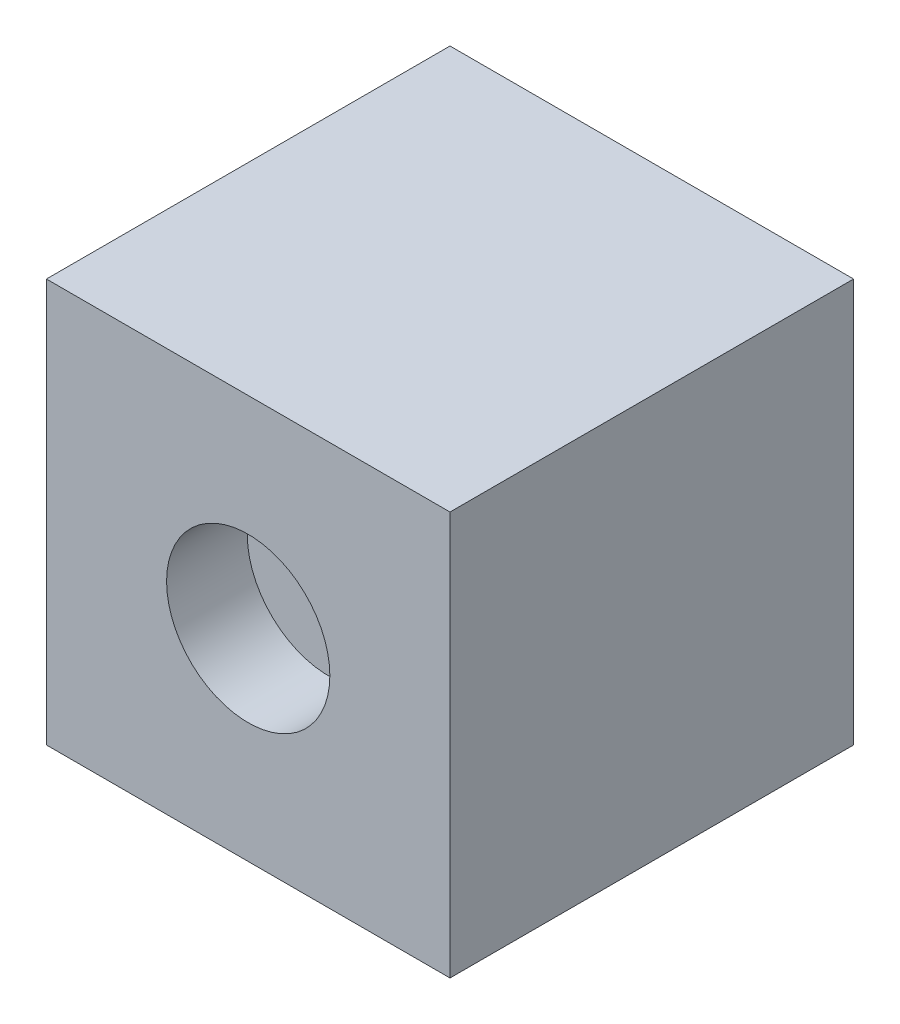
ISO-10303-21;
HEADER;
FILE_DESCRIPTION(('STEP AP214'),'2;1');
FILE_NAME('part.step','',(''),(''),'','','');
FILE_SCHEMA(('AUTOMOTIVE_DESIGN { 1 0 10303 214 1 1 1 1 }'));
ENDSEC;
DATA;
#1=APPLICATION_CONTEXT('core data for automotive mechanical design processes');
#2=APPLICATION_PROTOCOL_DEFINITION('international standard','automotive_design',2000,#1);
#3=PRODUCT_CONTEXT('',#1,'mechanical');
#4=PRODUCT('Part','Part','',(#3));
#5=PRODUCT_RELATED_PRODUCT_CATEGORY('part','',(#4));
#6=PRODUCT_DEFINITION_FORMATION('','',#4);
#7=PRODUCT_DEFINITION_CONTEXT('part definition',#1,'design');
#8=PRODUCT_DEFINITION('design','',#6,#7);
#9=PRODUCT_DEFINITION_SHAPE('','',#8);
#10=(LENGTH_UNIT() NAMED_UNIT(*) SI_UNIT(.MILLI.,.METRE.));
#11=(NAMED_UNIT(*) PLANE_ANGLE_UNIT() SI_UNIT($,.RADIAN.));
#12=(NAMED_UNIT(*) SI_UNIT($,.STERADIAN.) SOLID_ANGLE_UNIT());
#13=UNCERTAINTY_MEASURE_WITH_UNIT(LENGTH_MEASURE(1.E-05),#10,'distance_accuracy_value','');
#14=(GEOMETRIC_REPRESENTATION_CONTEXT(3) GLOBAL_UNCERTAINTY_ASSIGNED_CONTEXT((#13)) GLOBAL_UNIT_ASSIGNED_CONTEXT((#10,
#11,#12)) REPRESENTATION_CONTEXT('',''));
#15=CARTESIAN_POINT('',(0.,0.,0.));
#16=DIRECTION('',(0.,0.,1.));
#17=DIRECTION('',(1.,0.,0.));
#18=AXIS2_PLACEMENT_3D('',#15,#16,#17);
#19=CARTESIAN_POINT('',(25.,25.,50.));
#20=DIRECTION('',(-1.,0.,0.));
#21=DIRECTION('',(0.,-1.,0.));
#22=AXIS2_PLACEMENT_3D('',#19,#20,#21);
#23=PLANE('',#22);
#24=DIRECTION('',(0.,1.,0.));
#25=VECTOR('',#24,1.);
#26=CARTESIAN_POINT('',(25.,25.,0.));
#27=LINE('',#26,#25);
#28=CARTESIAN_POINT('',(25.,-25.,0.));
#29=VERTEX_POINT('',#28);
#30=CARTESIAN_POINT('',(25.,25.,0.));
#31=VERTEX_POINT('',#30);
#32=EDGE_CURVE('E113',#29,#31,#27,.T.);
#33=ORIENTED_EDGE('',*,*,#32,.T.);
#34=DIRECTION('',(0.,0.,-1.));
#35=VECTOR('',#34,1.);
#36=CARTESIAN_POINT('',(25.,25.,50.));
#37=LINE('',#36,#35);
#38=CARTESIAN_POINT('',(25.,25.,50.));
#39=VERTEX_POINT('',#38);
#40=EDGE_CURVE('E11',#39,#31,#37,.T.);
#41=ORIENTED_EDGE('',*,*,#40,.F.);
#42=DIRECTION('',(0.,1.,0.));
#43=VECTOR('',#42,1.);
#44=CARTESIAN_POINT('',(25.,25.,50.));
#45=LINE('',#44,#43);
#46=CARTESIAN_POINT('',(25.,-25.,50.));
#47=VERTEX_POINT('',#46);
#48=EDGE_CURVE('E97',#47,#39,#45,.T.);
#49=ORIENTED_EDGE('',*,*,#48,.F.);
#50=DIRECTION('',(0.,0.,-1.));
#51=VECTOR('',#50,1.);
#52=CARTESIAN_POINT('',(25.,-25.,50.));
#53=LINE('',#52,#51);
#54=EDGE_CURVE('E109',#47,#29,#53,.T.);
#55=ORIENTED_EDGE('',*,*,#54,.T.);
#56=EDGE_LOOP('',(#33,#41,#49,#55));
#57=FACE_BOUND('',#56,.T.);
#58=ADVANCED_FACE('F45',(#57),#23,.F.);
#59=CARTESIAN_POINT('',(-25.,25.,50.));
#60=DIRECTION('',(0.,-1.,0.));
#61=DIRECTION('',(0.,0.,-1.));
#62=AXIS2_PLACEMENT_3D('',#59,#60,#61);
#63=PLANE('',#62);
#64=DIRECTION('',(-1.,0.,0.));
#65=VECTOR('',#64,1.);
#66=CARTESIAN_POINT('',(-25.,25.,0.));
#67=LINE('',#66,#65);
#68=CARTESIAN_POINT('',(-25.,25.,0.));
#69=VERTEX_POINT('',#68);
#70=EDGE_CURVE('E102',#31,#69,#67,.T.);
#71=ORIENTED_EDGE('',*,*,#70,.T.);
#72=DIRECTION('',(0.,0.,-1.));
#73=VECTOR('',#72,1.);
#74=CARTESIAN_POINT('',(-25.,25.,50.));
#75=LINE('',#74,#73);
#76=CARTESIAN_POINT('',(-25.,25.,50.));
#77=VERTEX_POINT('',#76);
#78=EDGE_CURVE('E54',#77,#69,#75,.T.);
#79=ORIENTED_EDGE('',*,*,#78,.F.);
#80=DIRECTION('',(-1.,0.,0.));
#81=VECTOR('',#80,1.);
#82=CARTESIAN_POINT('',(-25.,25.,50.));
#83=LINE('',#82,#81);
#84=EDGE_CURVE('E92',#39,#77,#83,.T.);
#85=ORIENTED_EDGE('',*,*,#84,.F.);
#86=ORIENTED_EDGE('',*,*,#40,.T.);
#87=EDGE_LOOP('',(#71,#79,#85,#86));
#88=FACE_BOUND('',#87,.T.);
#89=ADVANCED_FACE('F101',(#88),#63,.F.);
#90=CARTESIAN_POINT('',(-25.,25.,50.));
#91=DIRECTION('',(1.,0.,0.));
#92=DIRECTION('',(0.,1.,0.));
#93=AXIS2_PLACEMENT_3D('',#90,#91,#92);
#94=PLANE('',#93);
#95=DIRECTION('',(0.,-1.,0.));
#96=VECTOR('',#95,1.);
#97=CARTESIAN_POINT('',(-25.,25.,0.));
#98=LINE('',#97,#96);
#99=CARTESIAN_POINT('',(-25.,-25.,0.));
#100=VERTEX_POINT('',#99);
#101=EDGE_CURVE('E79',#69,#100,#98,.T.);
#102=ORIENTED_EDGE('',*,*,#101,.T.);
#103=DIRECTION('',(0.,0.,-1.));
#104=VECTOR('',#103,1.);
#105=CARTESIAN_POINT('',(-25.,-25.,50.));
#106=LINE('',#105,#104);
#107=CARTESIAN_POINT('',(-25.,-25.,50.));
#108=VERTEX_POINT('',#107);
#109=EDGE_CURVE('E104',#108,#100,#106,.T.);
#110=ORIENTED_EDGE('',*,*,#109,.F.);
#111=DIRECTION('',(0.,-1.,0.));
#112=VECTOR('',#111,1.);
#113=CARTESIAN_POINT('',(-25.,25.,50.));
#114=LINE('',#113,#112);
#115=EDGE_CURVE('E95',#77,#108,#114,.T.);
#116=ORIENTED_EDGE('',*,*,#115,.F.);
#117=ORIENTED_EDGE('',*,*,#78,.T.);
#118=EDGE_LOOP('',(#102,#110,#116,#117));
#119=FACE_BOUND('',#118,.T.);
#120=ADVANCED_FACE('F105',(#119),#94,.F.);
#121=CARTESIAN_POINT('',(-25.,-25.,50.));
#122=DIRECTION('',(0.,1.,0.));
#123=DIRECTION('',(0.,0.,1.));
#124=AXIS2_PLACEMENT_3D('',#121,#122,#123);
#125=PLANE('',#124);
#126=DIRECTION('',(1.,0.,0.));
#127=VECTOR('',#126,1.);
#128=CARTESIAN_POINT('',(-25.,-25.,0.));
#129=LINE('',#128,#127);
#130=EDGE_CURVE('E85',#100,#29,#129,.T.);
#131=ORIENTED_EDGE('',*,*,#130,.T.);
#132=ORIENTED_EDGE('',*,*,#54,.F.);
#133=DIRECTION('',(1.,0.,0.));
#134=VECTOR('',#133,1.);
#135=CARTESIAN_POINT('',(-25.,-25.,50.));
#136=LINE('',#135,#134);
#137=EDGE_CURVE('E62',#108,#47,#136,.T.);
#138=ORIENTED_EDGE('',*,*,#137,.F.);
#139=ORIENTED_EDGE('',*,*,#109,.T.);
#140=EDGE_LOOP('',(#131,#132,#138,#139));
#141=FACE_BOUND('',#140,.T.);
#142=ADVANCED_FACE('F127',(#141),#125,.F.);
#143=CARTESIAN_POINT('',(0.,0.,50.));
#144=DIRECTION('',(0.,0.,1.));
#145=DIRECTION('',(1.,0.,0.));
#146=AXIS2_PLACEMENT_3D('',#143,#144,#145);
#147=PLANE('',#146);
#148=CARTESIAN_POINT('',(0.,0.,50.));
#149=DIRECTION('',(0.,0.,1.));
#150=DIRECTION('',(1.,0.,0.));
#151=AXIS2_PLACEMENT_3D('',#148,#149,#150);
#152=CIRCLE('',#151,10.1140155624917);
#153=CARTESIAN_POINT('',(10.1140155624917,0.,50.));
#154=VERTEX_POINT('',#153);
#155=EDGE_CURVE('E134',#154,#154,#152,.T.);
#156=ORIENTED_EDGE('',*,*,#155,.F.);
#157=EDGE_LOOP('',(#156));
#158=FACE_BOUND('',#157,.T.);
#159=ORIENTED_EDGE('',*,*,#48,.T.);
#160=ORIENTED_EDGE('',*,*,#84,.T.);
#161=ORIENTED_EDGE('',*,*,#115,.T.);
#162=ORIENTED_EDGE('',*,*,#137,.T.);
#163=EDGE_LOOP('',(#159,#160,#161,#162));
#164=FACE_BOUND('',#163,.T.);
#165=ADVANCED_FACE('F93',(#158,#164),#147,.T.);
#166=CARTESIAN_POINT('',(0.,0.,0.));
#167=DIRECTION('',(0.,0.,1.));
#168=DIRECTION('',(1.,0.,0.));
#169=AXIS2_PLACEMENT_3D('',#166,#167,#168);
#170=PLANE('',#169);
#171=ORIENTED_EDGE('',*,*,#32,.F.);
#172=ORIENTED_EDGE('',*,*,#130,.F.);
#173=ORIENTED_EDGE('',*,*,#101,.F.);
#174=ORIENTED_EDGE('',*,*,#70,.F.);
#175=EDGE_LOOP('',(#171,#172,#173,#174));
#176=FACE_BOUND('',#175,.T.);
#177=ADVANCED_FACE('F130',(#176),#170,.F.);
#178=CARTESIAN_POINT('',(0.,0.,40.));
#179=DIRECTION('',(0.,0.,1.));
#180=DIRECTION('',(1.,0.,0.));
#181=AXIS2_PLACEMENT_3D('',#178,#179,#180);
#182=CYLINDRICAL_SURFACE('',#181,10.1140155624917);
#183=CARTESIAN_POINT('',(0.,0.,40.));
#184=DIRECTION('',(0.,0.,1.));
#185=DIRECTION('',(1.,0.,0.));
#186=AXIS2_PLACEMENT_3D('',#183,#184,#185);
#187=CIRCLE('',#186,10.1140155624917);
#188=CARTESIAN_POINT('',(10.1140155624917,0.,40.));
#189=VERTEX_POINT('',#188);
#190=EDGE_CURVE('E117',#189,#189,#187,.T.);
#191=ORIENTED_EDGE('',*,*,#190,.F.);
#192=EDGE_LOOP('',(#191));
#193=FACE_BOUND('',#192,.T.);
#194=ORIENTED_EDGE('',*,*,#155,.T.);
#195=EDGE_LOOP('',(#194));
#196=FACE_BOUND('',#195,.T.);
#197=ADVANCED_FACE('F144',(#193,#196),#182,.F.);
#198=CARTESIAN_POINT('',(0.,0.,40.));
#199=DIRECTION('',(0.,0.,1.));
#200=DIRECTION('',(1.,0.,0.));
#201=AXIS2_PLACEMENT_3D('',#198,#199,#200);
#202=PLANE('',#201);
#203=ORIENTED_EDGE('',*,*,#190,.T.);
#204=EDGE_LOOP('',(#203));
#205=FACE_BOUND('',#204,.T.);
#206=ADVANCED_FACE('F142',(#205),#202,.T.);
#207=CLOSED_SHELL('',(#58,#89,#120,#142,#165,#177,#197,#206));
#208=MANIFOLD_SOLID_BREP('B2',#207);
#209=ADVANCED_BREP_SHAPE_REPRESENTATION('',(#18,#208),#14);
#210=SHAPE_DEFINITION_REPRESENTATION(#9,#209);
ENDSEC;
END-ISO-10303-21;
